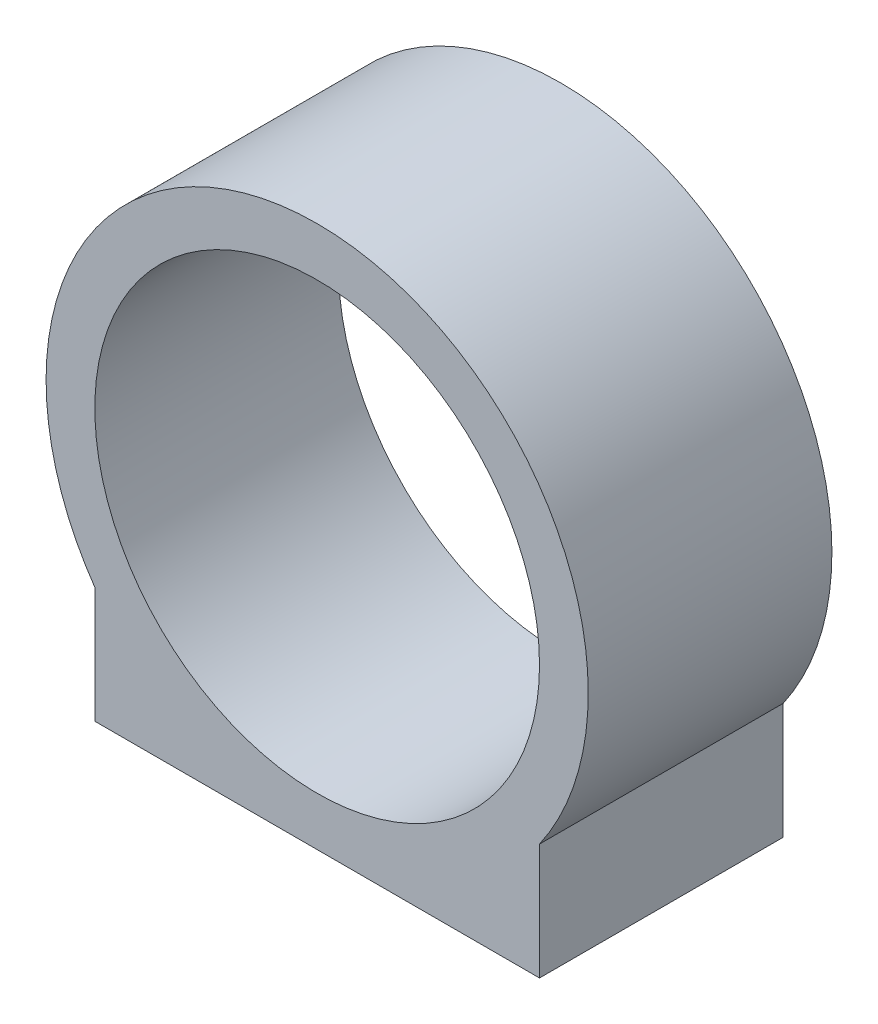
ISO-10303-21;
HEADER;
FILE_DESCRIPTION(('STEP AP214'),'2;1');
FILE_NAME('part.step','',(''),(''),'','','');
FILE_SCHEMA(('AUTOMOTIVE_DESIGN { 1 0 10303 214 1 1 1 1 }'));
ENDSEC;
DATA;
#1=APPLICATION_CONTEXT('core data for automotive mechanical design processes');
#2=APPLICATION_PROTOCOL_DEFINITION('international standard','automotive_design',2000,#1);
#3=PRODUCT_CONTEXT('',#1,'mechanical');
#4=PRODUCT('Part','Part','',(#3));
#5=PRODUCT_RELATED_PRODUCT_CATEGORY('part','',(#4));
#6=PRODUCT_DEFINITION_FORMATION('','',#4);
#7=PRODUCT_DEFINITION_CONTEXT('part definition',#1,'design');
#8=PRODUCT_DEFINITION('design','',#6,#7);
#9=PRODUCT_DEFINITION_SHAPE('','',#8);
#10=(LENGTH_UNIT() NAMED_UNIT(*) SI_UNIT(.MILLI.,.METRE.));
#11=(NAMED_UNIT(*) PLANE_ANGLE_UNIT() SI_UNIT($,.RADIAN.));
#12=(NAMED_UNIT(*) SI_UNIT($,.STERADIAN.) SOLID_ANGLE_UNIT());
#13=UNCERTAINTY_MEASURE_WITH_UNIT(LENGTH_MEASURE(1.E-05),#10,'distance_accuracy_value','');
#14=(GEOMETRIC_REPRESENTATION_CONTEXT(3) GLOBAL_UNCERTAINTY_ASSIGNED_CONTEXT((#13)) GLOBAL_UNIT_ASSIGNED_CONTEXT((#10,
#11,#12)) REPRESENTATION_CONTEXT('',''));
#15=CARTESIAN_POINT('',(0.,0.,0.));
#16=DIRECTION('',(0.,0.,1.));
#17=DIRECTION('',(1.,0.,0.));
#18=AXIS2_PLACEMENT_3D('',#15,#16,#17);
#19=CARTESIAN_POINT('',(0.,0.,10.));
#20=DIRECTION('',(0.,0.,1.));
#21=DIRECTION('',(1.,0.,0.));
#22=AXIS2_PLACEMENT_3D('',#19,#20,#21);
#23=PLANE('',#22);
#24=DIRECTION('',(-1.,0.,0.));
#25=VECTOR('',#24,1.);
#26=CARTESIAN_POINT('',(0.,-11.125,10.));
#27=LINE('',#26,#25);
#28=CARTESIAN_POINT('',(9.125,-11.125,10.));
#29=VERTEX_POINT('',#28);
#30=CARTESIAN_POINT('',(-9.125,-11.125,10.));
#31=VERTEX_POINT('',#30);
#32=EDGE_CURVE('E124',#29,#31,#27,.T.);
#33=ORIENTED_EDGE('',*,*,#32,.F.);
#34=DIRECTION('',(0.,1.,0.));
#35=VECTOR('',#34,1.);
#36=CARTESIAN_POINT('',(9.125,0.,10.));
#37=LINE('',#36,#35);
#38=CARTESIAN_POINT('',(9.125,-6.36396103067893,10.));
#39=VERTEX_POINT('',#38);
#40=EDGE_CURVE('E115',#29,#39,#37,.T.);
#41=ORIENTED_EDGE('',*,*,#40,.T.);
#42=CARTESIAN_POINT('',(0.,0.,10.));
#43=DIRECTION('',(0.,0.,1.));
#44=DIRECTION('',(1.,0.,0.));
#45=AXIS2_PLACEMENT_3D('',#42,#43,#44);
#46=CIRCLE('',#45,11.125);
#47=CARTESIAN_POINT('',(-9.125,-6.36396103067893,10.));
#48=VERTEX_POINT('',#47);
#49=EDGE_CURVE('E12',#39,#48,#46,.T.);
#50=ORIENTED_EDGE('',*,*,#49,.T.);
#51=DIRECTION('',(0.,1.,0.));
#52=VECTOR('',#51,1.);
#53=CARTESIAN_POINT('',(-9.125,0.,10.));
#54=LINE('',#53,#52);
#55=EDGE_CURVE('E111',#31,#48,#54,.T.);
#56=ORIENTED_EDGE('',*,*,#55,.F.);
#57=EDGE_LOOP('',(#33,#41,#50,#56));
#58=FACE_BOUND('',#57,.T.);
#59=CARTESIAN_POINT('',(0.,0.,10.));
#60=DIRECTION('',(0.,0.,1.));
#61=DIRECTION('',(1.,0.,0.));
#62=AXIS2_PLACEMENT_3D('',#59,#60,#61);
#63=CIRCLE('',#62,9.125);
#64=CARTESIAN_POINT('',(9.125,0.,10.));
#65=VERTEX_POINT('',#64);
#66=EDGE_CURVE('E128',#65,#65,#63,.T.);
#67=ORIENTED_EDGE('',*,*,#66,.F.);
#68=EDGE_LOOP('',(#67));
#69=FACE_BOUND('',#68,.T.);
#70=ADVANCED_FACE('F53',(#58,#69),#23,.T.);
#71=CARTESIAN_POINT('',(0.,0.,0.));
#72=DIRECTION('',(0.,0.,1.));
#73=DIRECTION('',(1.,0.,0.));
#74=AXIS2_PLACEMENT_3D('',#71,#72,#73);
#75=PLANE('',#74);
#76=CARTESIAN_POINT('',(0.,0.,0.));
#77=DIRECTION('',(0.,0.,1.));
#78=DIRECTION('',(1.,0.,0.));
#79=AXIS2_PLACEMENT_3D('',#76,#77,#78);
#80=CIRCLE('',#79,11.125);
#81=CARTESIAN_POINT('',(9.125,-6.36396103067893,0.));
#82=VERTEX_POINT('',#81);
#83=CARTESIAN_POINT('',(-9.125,-6.36396103067893,0.));
#84=VERTEX_POINT('',#83);
#85=EDGE_CURVE('E57',#82,#84,#80,.T.);
#86=ORIENTED_EDGE('',*,*,#85,.F.);
#87=DIRECTION('',(0.,-1.,0.));
#88=VECTOR('',#87,1.);
#89=CARTESIAN_POINT('',(9.125,0.,0.));
#90=LINE('',#89,#88);
#91=CARTESIAN_POINT('',(9.125,-11.125,0.));
#92=VERTEX_POINT('',#91);
#93=EDGE_CURVE('E107',#82,#92,#90,.T.);
#94=ORIENTED_EDGE('',*,*,#93,.T.);
#95=DIRECTION('',(1.,0.,0.));
#96=VECTOR('',#95,1.);
#97=CARTESIAN_POINT('',(0.,-11.125,0.));
#98=LINE('',#97,#96);
#99=CARTESIAN_POINT('',(-9.125,-11.125,0.));
#100=VERTEX_POINT('',#99);
#101=EDGE_CURVE('E94',#100,#92,#98,.T.);
#102=ORIENTED_EDGE('',*,*,#101,.F.);
#103=DIRECTION('',(0.,-1.,0.));
#104=VECTOR('',#103,1.);
#105=CARTESIAN_POINT('',(-9.125,0.,0.));
#106=LINE('',#105,#104);
#107=EDGE_CURVE('E104',#84,#100,#106,.T.);
#108=ORIENTED_EDGE('',*,*,#107,.F.);
#109=EDGE_LOOP('',(#86,#94,#102,#108));
#110=FACE_BOUND('',#109,.T.);
#111=CARTESIAN_POINT('',(0.,0.,0.));
#112=DIRECTION('',(0.,0.,1.));
#113=DIRECTION('',(1.,0.,0.));
#114=AXIS2_PLACEMENT_3D('',#111,#112,#113);
#115=CIRCLE('',#114,9.125);
#116=CARTESIAN_POINT('',(9.125,0.,0.));
#117=VERTEX_POINT('',#116);
#118=EDGE_CURVE('E121',#117,#117,#115,.T.);
#119=ORIENTED_EDGE('',*,*,#118,.T.);
#120=EDGE_LOOP('',(#119));
#121=FACE_BOUND('',#120,.T.);
#122=ADVANCED_FACE('F108',(#110,#121),#75,.F.);
#123=CARTESIAN_POINT('',(0.,0.,10.));
#124=DIRECTION('',(0.,0.,-1.));
#125=DIRECTION('',(-1.,0.,0.));
#126=AXIS2_PLACEMENT_3D('',#123,#124,#125);
#127=CYLINDRICAL_SURFACE('',#126,11.125);
#128=ORIENTED_EDGE('',*,*,#49,.F.);
#129=DIRECTION('',(0.,0.,1.));
#130=VECTOR('',#129,1.);
#131=CARTESIAN_POINT('',(9.125,-6.36396103067893,-10.2923815061138));
#132=LINE('',#131,#130);
#133=EDGE_CURVE('E112',#82,#39,#132,.T.);
#134=ORIENTED_EDGE('',*,*,#133,.F.);
#135=ORIENTED_EDGE('',*,*,#85,.T.);
#136=DIRECTION('',(0.,0.,1.));
#137=VECTOR('',#136,1.);
#138=CARTESIAN_POINT('',(-9.125,-6.36396103067893,-10.2923815061138));
#139=LINE('',#138,#137);
#140=EDGE_CURVE('E105',#84,#48,#139,.T.);
#141=ORIENTED_EDGE('',*,*,#140,.T.);
#142=EDGE_LOOP('',(#128,#134,#135,#141));
#143=FACE_BOUND('',#142,.T.);
#144=ADVANCED_FACE('F55',(#143),#127,.T.);
#145=CARTESIAN_POINT('',(0.,0.,10.));
#146=DIRECTION('',(0.,0.,-1.));
#147=DIRECTION('',(-1.,0.,0.));
#148=AXIS2_PLACEMENT_3D('',#145,#146,#147);
#149=CYLINDRICAL_SURFACE('',#148,9.125);
#150=ORIENTED_EDGE('',*,*,#66,.T.);
#151=EDGE_LOOP('',(#150));
#152=FACE_BOUND('',#151,.T.);
#153=ORIENTED_EDGE('',*,*,#118,.F.);
#154=EDGE_LOOP('',(#153));
#155=FACE_BOUND('',#154,.T.);
#156=ADVANCED_FACE('F134',(#152,#155),#149,.F.);
#157=CARTESIAN_POINT('',(0.,-11.125,-10.2923815061138));
#158=DIRECTION('',(0.,1.,0.));
#159=DIRECTION('',(0.,0.,1.));
#160=AXIS2_PLACEMENT_3D('',#157,#158,#159);
#161=PLANE('',#160);
#162=DIRECTION('',(0.,0.,1.));
#163=VECTOR('',#162,1.);
#164=CARTESIAN_POINT('',(-9.125,-11.125,-10.2923815061138));
#165=LINE('',#164,#163);
#166=EDGE_CURVE('E101',#100,#31,#165,.T.);
#167=ORIENTED_EDGE('',*,*,#166,.F.);
#168=ORIENTED_EDGE('',*,*,#101,.T.);
#169=DIRECTION('',(0.,0.,1.));
#170=VECTOR('',#169,1.);
#171=CARTESIAN_POINT('',(9.125,-11.125,-10.2923815061138));
#172=LINE('',#171,#170);
#173=EDGE_CURVE('E99',#92,#29,#172,.T.);
#174=ORIENTED_EDGE('',*,*,#173,.T.);
#175=ORIENTED_EDGE('',*,*,#32,.T.);
#176=EDGE_LOOP('',(#167,#168,#174,#175));
#177=FACE_BOUND('',#176,.T.);
#178=ADVANCED_FACE('F96',(#177),#161,.F.);
#179=CARTESIAN_POINT('',(-9.125,0.,-10.2923815061138));
#180=DIRECTION('',(1.,0.,0.));
#181=DIRECTION('',(0.,0.,-1.));
#182=AXIS2_PLACEMENT_3D('',#179,#180,#181);
#183=PLANE('',#182);
#184=ORIENTED_EDGE('',*,*,#140,.F.);
#185=ORIENTED_EDGE('',*,*,#107,.T.);
#186=ORIENTED_EDGE('',*,*,#166,.T.);
#187=ORIENTED_EDGE('',*,*,#55,.T.);
#188=EDGE_LOOP('',(#184,#185,#186,#187));
#189=FACE_BOUND('',#188,.T.);
#190=ADVANCED_FACE('F142',(#189),#183,.F.);
#191=CARTESIAN_POINT('',(9.125,0.,-10.2923815061138));
#192=DIRECTION('',(1.,0.,0.));
#193=DIRECTION('',(0.,0.,-1.));
#194=AXIS2_PLACEMENT_3D('',#191,#192,#193);
#195=PLANE('',#194);
#196=ORIENTED_EDGE('',*,*,#93,.F.);
#197=ORIENTED_EDGE('',*,*,#133,.T.);
#198=ORIENTED_EDGE('',*,*,#40,.F.);
#199=ORIENTED_EDGE('',*,*,#173,.F.);
#200=EDGE_LOOP('',(#196,#197,#198,#199));
#201=FACE_BOUND('',#200,.T.);
#202=ADVANCED_FACE('F114',(#201),#195,.T.);
#203=CLOSED_SHELL('',(#70,#122,#144,#156,#178,#190,#202));
#204=MANIFOLD_SOLID_BREP('B2',#203);
#205=ADVANCED_BREP_SHAPE_REPRESENTATION('',(#18,#204),#14);
#206=SHAPE_DEFINITION_REPRESENTATION(#9,#205);
ENDSEC;
END-ISO-10303-21;
